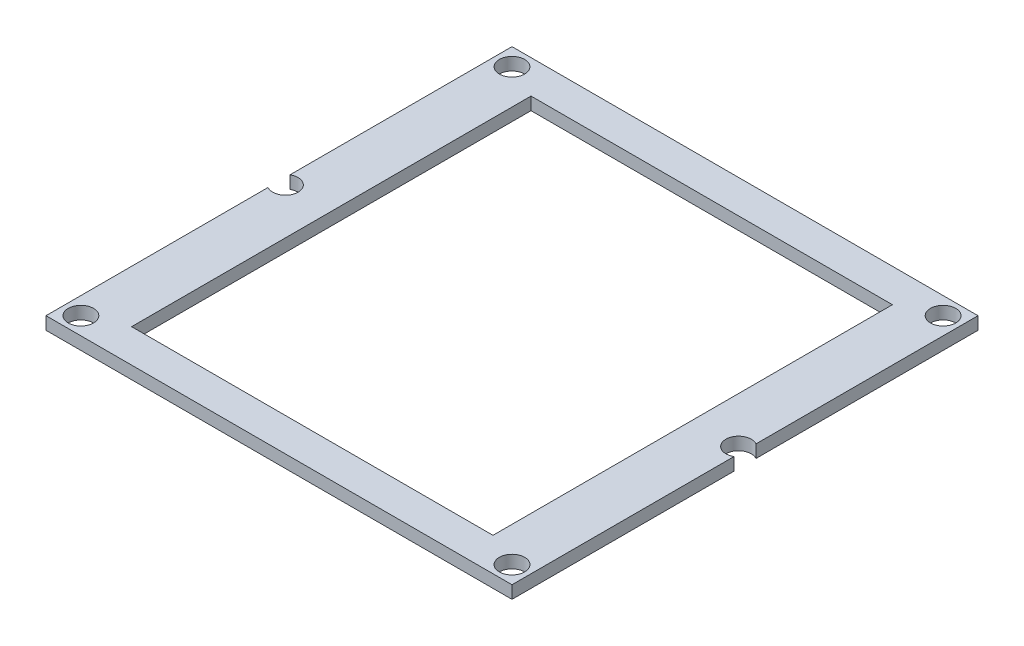
ISO-10303-21;
HEADER;
FILE_DESCRIPTION(('STEP AP214'),'2;1');
FILE_NAME('part.step','',(''),(''),'','','');
FILE_SCHEMA(('AUTOMOTIVE_DESIGN { 1 0 10303 214 1 1 1 1 }'));
ENDSEC;
DATA;
#1=APPLICATION_CONTEXT('core data for automotive mechanical design processes');
#2=APPLICATION_PROTOCOL_DEFINITION('international standard','automotive_design',2000,#1);
#3=PRODUCT_CONTEXT('',#1,'mechanical');
#4=PRODUCT('Part','Part','',(#3));
#5=PRODUCT_RELATED_PRODUCT_CATEGORY('part','',(#4));
#6=PRODUCT_DEFINITION_FORMATION('','',#4);
#7=PRODUCT_DEFINITION_CONTEXT('part definition',#1,'design');
#8=PRODUCT_DEFINITION('design','',#6,#7);
#9=PRODUCT_DEFINITION_SHAPE('','',#8);
#10=(LENGTH_UNIT() NAMED_UNIT(*) SI_UNIT(.MILLI.,.METRE.));
#11=(NAMED_UNIT(*) PLANE_ANGLE_UNIT() SI_UNIT($,.RADIAN.));
#12=(NAMED_UNIT(*) SI_UNIT($,.STERADIAN.) SOLID_ANGLE_UNIT());
#13=UNCERTAINTY_MEASURE_WITH_UNIT(LENGTH_MEASURE(1.E-05),#10,'distance_accuracy_value','');
#14=(GEOMETRIC_REPRESENTATION_CONTEXT(3) GLOBAL_UNCERTAINTY_ASSIGNED_CONTEXT((#13)) GLOBAL_UNIT_ASSIGNED_CONTEXT((#10,
#11,#12)) REPRESENTATION_CONTEXT('',''));
#15=CARTESIAN_POINT('',(0.,0.,0.));
#16=DIRECTION('',(0.,0.,1.));
#17=DIRECTION('',(1.,0.,0.));
#18=AXIS2_PLACEMENT_3D('',#15,#16,#17);
#19=CARTESIAN_POINT('',(0.,8.,0.));
#20=DIRECTION('',(0.,-1.,0.));
#21=DIRECTION('',(0.,0.,-1.));
#22=AXIS2_PLACEMENT_3D('',#19,#20,#21);
#23=PLANE('',#22);
#24=CARTESIAN_POINT('',(-136.,8.,136.));
#25=DIRECTION('',(0.,1.,0.));
#26=DIRECTION('',(0.,0.,-1.));
#27=AXIS2_PLACEMENT_3D('',#24,#25,#26);
#28=CIRCLE('',#27,8.00000000000001);
#29=CARTESIAN_POINT('',(-136.,8.,128.));
#30=VERTEX_POINT('',#29);
#31=EDGE_CURVE('E294',#30,#30,#28,.T.);
#32=ORIENTED_EDGE('',*,*,#31,.F.);
#33=EDGE_LOOP('',(#32));
#34=FACE_BOUND('',#33,.T.);
#35=CARTESIAN_POINT('',(-136.,8.,-136.));
#36=DIRECTION('',(0.,-1.,0.));
#37=DIRECTION('',(0.,0.,1.));
#38=AXIS2_PLACEMENT_3D('',#35,#36,#37);
#39=CIRCLE('',#38,8.00000000000001);
#40=CARTESIAN_POINT('',(-136.,8.,-128.));
#41=VERTEX_POINT('',#40);
#42=EDGE_CURVE('E195',#41,#41,#39,.T.);
#43=ORIENTED_EDGE('',*,*,#42,.T.);
#44=EDGE_LOOP('',(#43));
#45=FACE_BOUND('',#44,.T.);
#46=CARTESIAN_POINT('',(136.,8.,136.));
#47=DIRECTION('',(0.,-1.,0.));
#48=DIRECTION('',(0.,0.,-1.));
#49=AXIS2_PLACEMENT_3D('',#46,#47,#48);
#50=CIRCLE('',#49,8.00000000000001);
#51=CARTESIAN_POINT('',(136.,8.,128.));
#52=VERTEX_POINT('',#51);
#53=EDGE_CURVE('E193',#52,#52,#50,.T.);
#54=ORIENTED_EDGE('',*,*,#53,.T.);
#55=EDGE_LOOP('',(#54));
#56=FACE_BOUND('',#55,.T.);
#57=DIRECTION('',(0.,0.,-1.));
#58=VECTOR('',#57,1.);
#59=CARTESIAN_POINT('',(114.,8.,126.));
#60=LINE('',#59,#58);
#61=CARTESIAN_POINT('',(114.,8.,126.));
#62=VERTEX_POINT('',#61);
#63=CARTESIAN_POINT('',(114.,8.,-126.));
#64=VERTEX_POINT('',#63);
#65=EDGE_CURVE('E210',#62,#64,#60,.T.);
#66=ORIENTED_EDGE('',*,*,#65,.F.);
#67=DIRECTION('',(1.,0.,0.));
#68=VECTOR('',#67,1.);
#69=CARTESIAN_POINT('',(-114.,8.,126.));
#70=LINE('',#69,#68);
#71=CARTESIAN_POINT('',(-114.,8.,126.));
#72=VERTEX_POINT('',#71);
#73=EDGE_CURVE('E218',#72,#62,#70,.T.);
#74=ORIENTED_EDGE('',*,*,#73,.F.);
#75=DIRECTION('',(0.,0.,1.));
#76=VECTOR('',#75,1.);
#77=CARTESIAN_POINT('',(-114.,8.,126.));
#78=LINE('',#77,#76);
#79=CARTESIAN_POINT('',(-114.,8.,-126.));
#80=VERTEX_POINT('',#79);
#81=EDGE_CURVE('E215',#80,#72,#78,.T.);
#82=ORIENTED_EDGE('',*,*,#81,.F.);
#83=DIRECTION('',(-1.,0.,0.));
#84=VECTOR('',#83,1.);
#85=CARTESIAN_POINT('',(-114.,8.,-126.));
#86=LINE('',#85,#84);
#87=EDGE_CURVE('E212',#64,#80,#86,.T.);
#88=ORIENTED_EDGE('',*,*,#87,.F.);
#89=EDGE_LOOP('',(#66,#74,#82,#88));
#90=FACE_BOUND('',#89,.T.);
#91=CARTESIAN_POINT('',(136.,8.,-136.));
#92=DIRECTION('',(0.,1.,0.));
#93=DIRECTION('',(0.,0.,1.));
#94=AXIS2_PLACEMENT_3D('',#91,#92,#93);
#95=CIRCLE('',#94,8.00000000000001);
#96=CARTESIAN_POINT('',(136.,8.,-128.));
#97=VERTEX_POINT('',#96);
#98=EDGE_CURVE('E204',#97,#97,#95,.T.);
#99=ORIENTED_EDGE('',*,*,#98,.F.);
#100=EDGE_LOOP('',(#99));
#101=FACE_BOUND('',#100,.T.);
#102=CARTESIAN_POINT('',(-142.94,8.,0.));
#103=DIRECTION('',(0.,-1.,0.));
#104=DIRECTION('',(0.,0.,1.));
#105=AXIS2_PLACEMENT_3D('',#102,#103,#104);
#106=CIRCLE('',#105,8.00000000000001);
#107=CARTESIAN_POINT('',(-147.,8.,-6.8932140544161));
#108=VERTEX_POINT('',#107);
#109=CARTESIAN_POINT('',(-147.,8.,6.8932140544161));
#110=VERTEX_POINT('',#109);
#111=EDGE_CURVE('E120',#108,#110,#106,.T.);
#112=ORIENTED_EDGE('',*,*,#111,.T.);
#113=DIRECTION('',(0.,0.,1.));
#114=VECTOR('',#113,1.);
#115=CARTESIAN_POINT('',(-147.,8.,147.));
#116=LINE('',#115,#114);
#117=CARTESIAN_POINT('',(-147.,8.,147.));
#118=VERTEX_POINT('',#117);
#119=EDGE_CURVE('E128',#110,#118,#116,.T.);
#120=ORIENTED_EDGE('',*,*,#119,.T.);
#121=DIRECTION('',(1.,0.,0.));
#122=VECTOR('',#121,1.);
#123=CARTESIAN_POINT('',(-147.,8.,147.));
#124=LINE('',#123,#122);
#125=CARTESIAN_POINT('',(147.,8.,147.));
#126=VERTEX_POINT('',#125);
#127=EDGE_CURVE('E139',#118,#126,#124,.T.);
#128=ORIENTED_EDGE('',*,*,#127,.T.);
#129=DIRECTION('',(0.,0.,-1.));
#130=VECTOR('',#129,1.);
#131=CARTESIAN_POINT('',(147.,8.,-147.));
#132=LINE('',#131,#130);
#133=CARTESIAN_POINT('',(147.,8.,6.89321405441613));
#134=VERTEX_POINT('',#133);
#135=EDGE_CURVE('E146',#126,#134,#132,.T.);
#136=ORIENTED_EDGE('',*,*,#135,.T.);
#137=CARTESIAN_POINT('',(142.94,8.,0.));
#138=DIRECTION('',(0.,1.,0.));
#139=DIRECTION('',(0.,0.,1.));
#140=AXIS2_PLACEMENT_3D('',#137,#138,#139);
#141=CIRCLE('',#140,8.00000000000001);
#142=CARTESIAN_POINT('',(147.,8.,-6.89321405441613));
#143=VERTEX_POINT('',#142);
#144=EDGE_CURVE('E180',#143,#134,#141,.T.);
#145=ORIENTED_EDGE('',*,*,#144,.F.);
#146=CARTESIAN_POINT('',(147.,8.,-147.));
#147=VERTEX_POINT('',#146);
#148=EDGE_CURVE('E145',#143,#147,#132,.T.);
#149=ORIENTED_EDGE('',*,*,#148,.T.);
#150=DIRECTION('',(-1.,0.,0.));
#151=VECTOR('',#150,1.);
#152=CARTESIAN_POINT('',(-147.,8.,-147.));
#153=LINE('',#152,#151);
#154=CARTESIAN_POINT('',(-147.,8.,-147.));
#155=VERTEX_POINT('',#154);
#156=EDGE_CURVE('E137',#147,#155,#153,.T.);
#157=ORIENTED_EDGE('',*,*,#156,.T.);
#158=EDGE_CURVE('E131',#155,#108,#116,.T.);
#159=ORIENTED_EDGE('',*,*,#158,.T.);
#160=EDGE_LOOP('',(#112,#120,#128,#136,#145,#149,#157,#159));
#161=FACE_BOUND('',#160,.T.);
#162=ADVANCED_FACE('F33',(#34,#45,#56,#90,#101,#161),#23,.F.);
#163=CARTESIAN_POINT('',(0.,0.,0.));
#164=DIRECTION('',(0.,-1.,0.));
#165=DIRECTION('',(0.,0.,-1.));
#166=AXIS2_PLACEMENT_3D('',#163,#164,#165);
#167=PLANE('',#166);
#168=CARTESIAN_POINT('',(-136.,0.,136.));
#169=DIRECTION('',(0.,1.,0.));
#170=DIRECTION('',(0.,0.,-1.));
#171=AXIS2_PLACEMENT_3D('',#168,#169,#170);
#172=CIRCLE('',#171,8.00000000000001);
#173=CARTESIAN_POINT('',(-136.,0.,128.));
#174=VERTEX_POINT('',#173);
#175=EDGE_CURVE('E291',#174,#174,#172,.T.);
#176=ORIENTED_EDGE('',*,*,#175,.T.);
#177=EDGE_LOOP('',(#176));
#178=FACE_BOUND('',#177,.T.);
#179=CARTESIAN_POINT('',(-136.,0.,-136.));
#180=DIRECTION('',(0.,-1.,0.));
#181=DIRECTION('',(0.,0.,1.));
#182=AXIS2_PLACEMENT_3D('',#179,#180,#181);
#183=CIRCLE('',#182,8.00000000000001);
#184=CARTESIAN_POINT('',(-136.,0.,-128.));
#185=VERTEX_POINT('',#184);
#186=EDGE_CURVE('E198',#185,#185,#183,.T.);
#187=ORIENTED_EDGE('',*,*,#186,.F.);
#188=EDGE_LOOP('',(#187));
#189=FACE_BOUND('',#188,.T.);
#190=CARTESIAN_POINT('',(136.,0.,136.));
#191=DIRECTION('',(0.,-1.,0.));
#192=DIRECTION('',(0.,0.,-1.));
#193=AXIS2_PLACEMENT_3D('',#190,#191,#192);
#194=CIRCLE('',#193,8.00000000000001);
#195=CARTESIAN_POINT('',(136.,0.,128.));
#196=VERTEX_POINT('',#195);
#197=EDGE_CURVE('E190',#196,#196,#194,.T.);
#198=ORIENTED_EDGE('',*,*,#197,.F.);
#199=EDGE_LOOP('',(#198));
#200=FACE_BOUND('',#199,.T.);
#201=DIRECTION('',(1.,0.,0.));
#202=VECTOR('',#201,1.);
#203=CARTESIAN_POINT('',(-114.,0.,126.));
#204=LINE('',#203,#202);
#205=CARTESIAN_POINT('',(-114.,0.,126.));
#206=VERTEX_POINT('',#205);
#207=CARTESIAN_POINT('',(114.,0.,126.));
#208=VERTEX_POINT('',#207);
#209=EDGE_CURVE('E213',#206,#208,#204,.T.);
#210=ORIENTED_EDGE('',*,*,#209,.T.);
#211=DIRECTION('',(0.,0.,-1.));
#212=VECTOR('',#211,1.);
#213=CARTESIAN_POINT('',(114.,0.,126.));
#214=LINE('',#213,#212);
#215=CARTESIAN_POINT('',(114.,0.,-126.));
#216=VERTEX_POINT('',#215);
#217=EDGE_CURVE('E207',#208,#216,#214,.T.);
#218=ORIENTED_EDGE('',*,*,#217,.T.);
#219=DIRECTION('',(-1.,0.,0.));
#220=VECTOR('',#219,1.);
#221=CARTESIAN_POINT('',(-114.,0.,-126.));
#222=LINE('',#221,#220);
#223=CARTESIAN_POINT('',(-114.,0.,-126.));
#224=VERTEX_POINT('',#223);
#225=EDGE_CURVE('E223',#216,#224,#222,.T.);
#226=ORIENTED_EDGE('',*,*,#225,.T.);
#227=DIRECTION('',(0.,0.,1.));
#228=VECTOR('',#227,1.);
#229=CARTESIAN_POINT('',(-114.,0.,126.));
#230=LINE('',#229,#228);
#231=EDGE_CURVE('E226',#224,#206,#230,.T.);
#232=ORIENTED_EDGE('',*,*,#231,.T.);
#233=EDGE_LOOP('',(#210,#218,#226,#232));
#234=FACE_BOUND('',#233,.T.);
#235=CARTESIAN_POINT('',(136.,0.,-136.));
#236=DIRECTION('',(0.,1.,0.));
#237=DIRECTION('',(0.,0.,1.));
#238=AXIS2_PLACEMENT_3D('',#235,#236,#237);
#239=CIRCLE('',#238,8.00000000000001);
#240=CARTESIAN_POINT('',(136.,0.,-128.));
#241=VERTEX_POINT('',#240);
#242=EDGE_CURVE('E202',#241,#241,#239,.T.);
#243=ORIENTED_EDGE('',*,*,#242,.T.);
#244=EDGE_LOOP('',(#243));
#245=FACE_BOUND('',#244,.T.);
#246=DIRECTION('',(0.,0.,1.));
#247=VECTOR('',#246,1.);
#248=CARTESIAN_POINT('',(-147.,0.,147.));
#249=LINE('',#248,#247);
#250=CARTESIAN_POINT('',(-147.,0.,6.89321405441609));
#251=VERTEX_POINT('',#250);
#252=CARTESIAN_POINT('',(-147.,0.,147.));
#253=VERTEX_POINT('',#252);
#254=EDGE_CURVE('E153',#251,#253,#249,.T.);
#255=ORIENTED_EDGE('',*,*,#254,.F.);
#256=CARTESIAN_POINT('',(-142.94,0.,0.));
#257=DIRECTION('',(0.,-1.,0.));
#258=DIRECTION('',(0.,0.,1.));
#259=AXIS2_PLACEMENT_3D('',#256,#257,#258);
#260=CIRCLE('',#259,8.00000000000001);
#261=CARTESIAN_POINT('',(-147.,0.,-6.8932140544161));
#262=VERTEX_POINT('',#261);
#263=EDGE_CURVE('E47',#262,#251,#260,.T.);
#264=ORIENTED_EDGE('',*,*,#263,.F.);
#265=CARTESIAN_POINT('',(-147.,0.,-147.));
#266=VERTEX_POINT('',#265);
#267=EDGE_CURVE('E155',#266,#262,#249,.T.);
#268=ORIENTED_EDGE('',*,*,#267,.F.);
#269=DIRECTION('',(-1.,0.,0.));
#270=VECTOR('',#269,1.);
#271=CARTESIAN_POINT('',(-147.,0.,-147.));
#272=LINE('',#271,#270);
#273=CARTESIAN_POINT('',(147.,0.,-147.));
#274=VERTEX_POINT('',#273);
#275=EDGE_CURVE('E150',#274,#266,#272,.T.);
#276=ORIENTED_EDGE('',*,*,#275,.F.);
#277=DIRECTION('',(0.,0.,-1.));
#278=VECTOR('',#277,1.);
#279=CARTESIAN_POINT('',(147.,0.,-147.));
#280=LINE('',#279,#278);
#281=CARTESIAN_POINT('',(147.,0.,-6.89321405441612));
#282=VERTEX_POINT('',#281);
#283=EDGE_CURVE('E160',#282,#274,#280,.T.);
#284=ORIENTED_EDGE('',*,*,#283,.F.);
#285=CARTESIAN_POINT('',(142.94,0.,0.));
#286=DIRECTION('',(0.,1.,0.));
#287=DIRECTION('',(0.,0.,1.));
#288=AXIS2_PLACEMENT_3D('',#285,#286,#287);
#289=CIRCLE('',#288,8.00000000000001);
#290=CARTESIAN_POINT('',(147.,0.,6.89321405441613));
#291=VERTEX_POINT('',#290);
#292=EDGE_CURVE('E55',#282,#291,#289,.T.);
#293=ORIENTED_EDGE('',*,*,#292,.T.);
#294=CARTESIAN_POINT('',(147.,0.,147.));
#295=VERTEX_POINT('',#294);
#296=EDGE_CURVE('E140',#295,#291,#280,.T.);
#297=ORIENTED_EDGE('',*,*,#296,.F.);
#298=DIRECTION('',(1.,0.,0.));
#299=VECTOR('',#298,1.);
#300=CARTESIAN_POINT('',(-147.,0.,147.));
#301=LINE('',#300,#299);
#302=EDGE_CURVE('E158',#253,#295,#301,.T.);
#303=ORIENTED_EDGE('',*,*,#302,.F.);
#304=EDGE_LOOP('',(#255,#264,#268,#276,#284,#293,#297,#303));
#305=FACE_BOUND('',#304,.T.);
#306=ADVANCED_FACE('F187',(#178,#189,#200,#234,#245,#305),#167,.T.);
#307=CARTESIAN_POINT('',(-147.,8.,147.));
#308=DIRECTION('',(1.,0.,0.));
#309=DIRECTION('',(0.,0.,-1.));
#310=AXIS2_PLACEMENT_3D('',#307,#308,#309);
#311=PLANE('',#310);
#312=DIRECTION('',(0.,1.,0.));
#313=VECTOR('',#312,1.);
#314=CARTESIAN_POINT('',(-147.,0.,-6.8932140544161));
#315=LINE('',#314,#313);
#316=EDGE_CURVE('E11',#108,#262,#315,.F.);
#317=ORIENTED_EDGE('',*,*,#316,.F.);
#318=ORIENTED_EDGE('',*,*,#158,.F.);
#319=DIRECTION('',(0.,-1.,0.));
#320=VECTOR('',#319,1.);
#321=CARTESIAN_POINT('',(-147.,8.,-147.));
#322=LINE('',#321,#320);
#323=EDGE_CURVE('E169',#155,#266,#322,.T.);
#324=ORIENTED_EDGE('',*,*,#323,.T.);
#325=ORIENTED_EDGE('',*,*,#267,.T.);
#326=EDGE_LOOP('',(#317,#318,#324,#325));
#327=FACE_BOUND('',#326,.T.);
#328=ADVANCED_FACE('F274',(#327),#311,.F.);
#329=DIRECTION('',(0.,1.,0.));
#330=VECTOR('',#329,1.);
#331=CARTESIAN_POINT('',(-147.,0.,6.8932140544161));
#332=LINE('',#331,#330);
#333=EDGE_CURVE('E41',#251,#110,#332,.T.);
#334=ORIENTED_EDGE('',*,*,#333,.F.);
#335=ORIENTED_EDGE('',*,*,#254,.T.);
#336=DIRECTION('',(0.,-1.,0.));
#337=VECTOR('',#336,1.);
#338=CARTESIAN_POINT('',(-147.,8.,147.));
#339=LINE('',#338,#337);
#340=EDGE_CURVE('E135',#118,#253,#339,.T.);
#341=ORIENTED_EDGE('',*,*,#340,.F.);
#342=ORIENTED_EDGE('',*,*,#119,.F.);
#343=EDGE_LOOP('',(#334,#335,#341,#342));
#344=FACE_BOUND('',#343,.T.);
#345=ADVANCED_FACE('F133',(#344),#311,.F.);
#346=CARTESIAN_POINT('',(147.,8.,-147.));
#347=DIRECTION('',(-1.,0.,0.));
#348=DIRECTION('',(0.,0.,1.));
#349=AXIS2_PLACEMENT_3D('',#346,#347,#348);
#350=PLANE('',#349);
#351=ORIENTED_EDGE('',*,*,#296,.T.);
#352=DIRECTION('',(0.,1.,0.));
#353=VECTOR('',#352,1.);
#354=CARTESIAN_POINT('',(147.,0.,6.89321405441614));
#355=LINE('',#354,#353);
#356=EDGE_CURVE('E125',#291,#134,#355,.T.);
#357=ORIENTED_EDGE('',*,*,#356,.T.);
#358=ORIENTED_EDGE('',*,*,#135,.F.);
#359=DIRECTION('',(0.,-1.,0.));
#360=VECTOR('',#359,1.);
#361=CARTESIAN_POINT('',(147.,8.,147.));
#362=LINE('',#361,#360);
#363=EDGE_CURVE('E165',#126,#295,#362,.T.);
#364=ORIENTED_EDGE('',*,*,#363,.T.);
#365=EDGE_LOOP('',(#351,#357,#358,#364));
#366=FACE_BOUND('',#365,.T.);
#367=ADVANCED_FACE('F177',(#366),#350,.F.);
#368=CARTESIAN_POINT('',(-147.,8.,-147.));
#369=DIRECTION('',(0.,0.,1.));
#370=DIRECTION('',(1.,0.,0.));
#371=AXIS2_PLACEMENT_3D('',#368,#369,#370);
#372=PLANE('',#371);
#373=ORIENTED_EDGE('',*,*,#275,.T.);
#374=ORIENTED_EDGE('',*,*,#323,.F.);
#375=ORIENTED_EDGE('',*,*,#156,.F.);
#376=DIRECTION('',(0.,-1.,0.));
#377=VECTOR('',#376,1.);
#378=CARTESIAN_POINT('',(147.,8.,-147.));
#379=LINE('',#378,#377);
#380=EDGE_CURVE('E149',#147,#274,#379,.T.);
#381=ORIENTED_EDGE('',*,*,#380,.T.);
#382=EDGE_LOOP('',(#373,#374,#375,#381));
#383=FACE_BOUND('',#382,.T.);
#384=ADVANCED_FACE('F35',(#383),#372,.F.);
#385=CARTESIAN_POINT('',(-147.,8.,147.));
#386=DIRECTION('',(0.,0.,-1.));
#387=DIRECTION('',(-1.,0.,0.));
#388=AXIS2_PLACEMENT_3D('',#385,#386,#387);
#389=PLANE('',#388);
#390=ORIENTED_EDGE('',*,*,#302,.T.);
#391=ORIENTED_EDGE('',*,*,#363,.F.);
#392=ORIENTED_EDGE('',*,*,#127,.F.);
#393=ORIENTED_EDGE('',*,*,#340,.T.);
#394=EDGE_LOOP('',(#390,#391,#392,#393));
#395=FACE_BOUND('',#394,.T.);
#396=ADVANCED_FACE('F184',(#395),#389,.F.);
#397=ORIENTED_EDGE('',*,*,#148,.F.);
#398=DIRECTION('',(0.,1.,0.));
#399=VECTOR('',#398,1.);
#400=CARTESIAN_POINT('',(147.,0.,-6.89321405441614));
#401=LINE('',#400,#399);
#402=EDGE_CURVE('E172',#143,#282,#401,.F.);
#403=ORIENTED_EDGE('',*,*,#402,.T.);
#404=ORIENTED_EDGE('',*,*,#283,.T.);
#405=ORIENTED_EDGE('',*,*,#380,.F.);
#406=EDGE_LOOP('',(#397,#403,#404,#405));
#407=FACE_BOUND('',#406,.T.);
#408=ADVANCED_FACE('F281',(#407),#350,.F.);
#409=CARTESIAN_POINT('',(114.,8.,126.));
#410=DIRECTION('',(-1.,0.,0.));
#411=DIRECTION('',(0.,0.,1.));
#412=AXIS2_PLACEMENT_3D('',#409,#410,#411);
#413=PLANE('',#412);
#414=ORIENTED_EDGE('',*,*,#217,.F.);
#415=DIRECTION('',(0.,-1.,0.));
#416=VECTOR('',#415,1.);
#417=CARTESIAN_POINT('',(114.,8.,126.));
#418=LINE('',#417,#416);
#419=EDGE_CURVE('E220',#62,#208,#418,.T.);
#420=ORIENTED_EDGE('',*,*,#419,.F.);
#421=ORIENTED_EDGE('',*,*,#65,.T.);
#422=DIRECTION('',(0.,-1.,0.));
#423=VECTOR('',#422,1.);
#424=CARTESIAN_POINT('',(114.,8.,-126.));
#425=LINE('',#424,#423);
#426=EDGE_CURVE('E154',#64,#216,#425,.T.);
#427=ORIENTED_EDGE('',*,*,#426,.T.);
#428=EDGE_LOOP('',(#414,#420,#421,#427));
#429=FACE_BOUND('',#428,.T.);
#430=ADVANCED_FACE('F239',(#429),#413,.T.);
#431=CARTESIAN_POINT('',(-114.,8.,-126.));
#432=DIRECTION('',(0.,0.,1.));
#433=DIRECTION('',(1.,0.,0.));
#434=AXIS2_PLACEMENT_3D('',#431,#432,#433);
#435=PLANE('',#434);
#436=ORIENTED_EDGE('',*,*,#225,.F.);
#437=ORIENTED_EDGE('',*,*,#426,.F.);
#438=ORIENTED_EDGE('',*,*,#87,.T.);
#439=DIRECTION('',(0.,-1.,0.));
#440=VECTOR('',#439,1.);
#441=CARTESIAN_POINT('',(-114.,8.,-126.));
#442=LINE('',#441,#440);
#443=EDGE_CURVE('E235',#80,#224,#442,.T.);
#444=ORIENTED_EDGE('',*,*,#443,.T.);
#445=EDGE_LOOP('',(#436,#437,#438,#444));
#446=FACE_BOUND('',#445,.T.);
#447=ADVANCED_FACE('F255',(#446),#435,.T.);
#448=CARTESIAN_POINT('',(-114.,8.,126.));
#449=DIRECTION('',(1.,0.,0.));
#450=DIRECTION('',(0.,0.,-1.));
#451=AXIS2_PLACEMENT_3D('',#448,#449,#450);
#452=PLANE('',#451);
#453=ORIENTED_EDGE('',*,*,#231,.F.);
#454=ORIENTED_EDGE('',*,*,#443,.F.);
#455=ORIENTED_EDGE('',*,*,#81,.T.);
#456=DIRECTION('',(0.,-1.,0.));
#457=VECTOR('',#456,1.);
#458=CARTESIAN_POINT('',(-114.,8.,126.));
#459=LINE('',#458,#457);
#460=EDGE_CURVE('E233',#72,#206,#459,.T.);
#461=ORIENTED_EDGE('',*,*,#460,.T.);
#462=EDGE_LOOP('',(#453,#454,#455,#461));
#463=FACE_BOUND('',#462,.T.);
#464=ADVANCED_FACE('F257',(#463),#452,.T.);
#465=CARTESIAN_POINT('',(-114.,8.,126.));
#466=DIRECTION('',(0.,0.,-1.));
#467=DIRECTION('',(-1.,0.,0.));
#468=AXIS2_PLACEMENT_3D('',#465,#466,#467);
#469=PLANE('',#468);
#470=ORIENTED_EDGE('',*,*,#209,.F.);
#471=ORIENTED_EDGE('',*,*,#460,.F.);
#472=ORIENTED_EDGE('',*,*,#73,.T.);
#473=ORIENTED_EDGE('',*,*,#419,.T.);
#474=EDGE_LOOP('',(#470,#471,#472,#473));
#475=FACE_BOUND('',#474,.T.);
#476=ADVANCED_FACE('F249',(#475),#469,.T.);
#477=CARTESIAN_POINT('',(136.,8.,-136.));
#478=DIRECTION('',(0.,-1.,0.));
#479=DIRECTION('',(0.,0.,-1.));
#480=AXIS2_PLACEMENT_3D('',#477,#478,#479);
#481=CYLINDRICAL_SURFACE('',#480,8.00000000000001);
#482=ORIENTED_EDGE('',*,*,#98,.T.);
#483=EDGE_LOOP('',(#482));
#484=FACE_BOUND('',#483,.T.);
#485=ORIENTED_EDGE('',*,*,#242,.F.);
#486=EDGE_LOOP('',(#485));
#487=FACE_BOUND('',#486,.T.);
#488=ADVANCED_FACE('F264',(#484,#487),#481,.F.);
#489=CARTESIAN_POINT('',(136.,8.,136.));
#490=DIRECTION('',(0.,-1.,0.));
#491=DIRECTION('',(0.,0.,-1.));
#492=AXIS2_PLACEMENT_3D('',#489,#490,#491);
#493=CYLINDRICAL_SURFACE('',#492,8.00000000000001);
#494=ORIENTED_EDGE('',*,*,#53,.F.);
#495=EDGE_LOOP('',(#494));
#496=FACE_BOUND('',#495,.T.);
#497=ORIENTED_EDGE('',*,*,#197,.T.);
#498=EDGE_LOOP('',(#497));
#499=FACE_BOUND('',#498,.T.);
#500=ADVANCED_FACE('F308',(#496,#499),#493,.F.);
#501=CARTESIAN_POINT('',(142.94,0.,0.));
#502=DIRECTION('',(0.,1.,0.));
#503=DIRECTION('',(0.,0.,1.));
#504=AXIS2_PLACEMENT_3D('',#501,#502,#503);
#505=CYLINDRICAL_SURFACE('',#504,8.00000000000001);
#506=ORIENTED_EDGE('',*,*,#292,.F.);
#507=ORIENTED_EDGE('',*,*,#402,.F.);
#508=ORIENTED_EDGE('',*,*,#144,.T.);
#509=ORIENTED_EDGE('',*,*,#356,.F.);
#510=EDGE_LOOP('',(#506,#507,#508,#509));
#511=FACE_BOUND('',#510,.T.);
#512=ADVANCED_FACE('F310',(#511),#505,.F.);
#513=CARTESIAN_POINT('',(-136.,8.,-136.));
#514=DIRECTION('',(0.,-1.,0.));
#515=DIRECTION('',(0.,0.,-1.));
#516=AXIS2_PLACEMENT_3D('',#513,#514,#515);
#517=CYLINDRICAL_SURFACE('',#516,8.00000000000001);
#518=ORIENTED_EDGE('',*,*,#42,.F.);
#519=EDGE_LOOP('',(#518));
#520=FACE_BOUND('',#519,.T.);
#521=ORIENTED_EDGE('',*,*,#186,.T.);
#522=EDGE_LOOP('',(#521));
#523=FACE_BOUND('',#522,.T.);
#524=ADVANCED_FACE('F303',(#520,#523),#517,.F.);
#525=CARTESIAN_POINT('',(-136.,8.,136.));
#526=DIRECTION('',(0.,-1.,0.));
#527=DIRECTION('',(0.,0.,-1.));
#528=AXIS2_PLACEMENT_3D('',#525,#526,#527);
#529=CYLINDRICAL_SURFACE('',#528,8.00000000000001);
#530=ORIENTED_EDGE('',*,*,#31,.T.);
#531=EDGE_LOOP('',(#530));
#532=FACE_BOUND('',#531,.T.);
#533=ORIENTED_EDGE('',*,*,#175,.F.);
#534=EDGE_LOOP('',(#533));
#535=FACE_BOUND('',#534,.T.);
#536=ADVANCED_FACE('F325',(#532,#535),#529,.F.);
#537=CARTESIAN_POINT('',(-142.94,0.,0.));
#538=DIRECTION('',(0.,1.,0.));
#539=DIRECTION('',(0.,0.,1.));
#540=AXIS2_PLACEMENT_3D('',#537,#538,#539);
#541=CYLINDRICAL_SURFACE('',#540,8.00000000000001);
#542=ORIENTED_EDGE('',*,*,#316,.T.);
#543=ORIENTED_EDGE('',*,*,#263,.T.);
#544=ORIENTED_EDGE('',*,*,#333,.T.);
#545=ORIENTED_EDGE('',*,*,#111,.F.);
#546=EDGE_LOOP('',(#542,#543,#544,#545));
#547=FACE_BOUND('',#546,.T.);
#548=ADVANCED_FACE('F119',(#547),#541,.F.);
#549=CLOSED_SHELL('',(#162,#306,#328,#345,#367,#384,#396,#408,#430,#447,#464,#476,#488,#500,
#512,#524,#536,#548));
#550=MANIFOLD_SOLID_BREP('B2',#549);
#551=ADVANCED_BREP_SHAPE_REPRESENTATION('',(#18,#550),#14);
#552=SHAPE_DEFINITION_REPRESENTATION(#9,#551);
ENDSEC;
END-ISO-10303-21;
